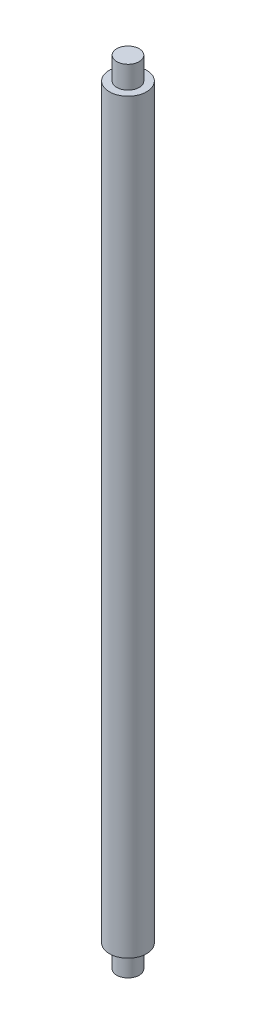
ISO-10303-21;
HEADER;
FILE_DESCRIPTION(('STEP AP214'),'2;1');
FILE_NAME('part.step','',(''),(''),'','','');
FILE_SCHEMA(('AUTOMOTIVE_DESIGN { 1 0 10303 214 1 1 1 1 }'));
ENDSEC;
DATA;
#1=APPLICATION_CONTEXT('core data for automotive mechanical design processes');
#2=APPLICATION_PROTOCOL_DEFINITION('international standard','automotive_design',2000,#1);
#3=PRODUCT_CONTEXT('',#1,'mechanical');
#4=PRODUCT('Part','Part','',(#3));
#5=PRODUCT_RELATED_PRODUCT_CATEGORY('part','',(#4));
#6=PRODUCT_DEFINITION_FORMATION('','',#4);
#7=PRODUCT_DEFINITION_CONTEXT('part definition',#1,'design');
#8=PRODUCT_DEFINITION('design','',#6,#7);
#9=PRODUCT_DEFINITION_SHAPE('','',#8);
#10=(LENGTH_UNIT() NAMED_UNIT(*) SI_UNIT(.MILLI.,.METRE.));
#11=(NAMED_UNIT(*) PLANE_ANGLE_UNIT() SI_UNIT($,.RADIAN.));
#12=(NAMED_UNIT(*) SI_UNIT($,.STERADIAN.) SOLID_ANGLE_UNIT());
#13=UNCERTAINTY_MEASURE_WITH_UNIT(LENGTH_MEASURE(1.E-05),#10,'distance_accuracy_value','');
#14=(GEOMETRIC_REPRESENTATION_CONTEXT(3) GLOBAL_UNCERTAINTY_ASSIGNED_CONTEXT((#13)) GLOBAL_UNIT_ASSIGNED_CONTEXT((#10,
#11,#12)) REPRESENTATION_CONTEXT('',''));
#15=CARTESIAN_POINT('',(0.,0.,0.));
#16=DIRECTION('',(0.,0.,1.));
#17=DIRECTION('',(1.,0.,0.));
#18=AXIS2_PLACEMENT_3D('',#15,#16,#17);
#19=CARTESIAN_POINT('',(0.,-50.,0.));
#20=DIRECTION('',(0.,1.,0.));
#21=DIRECTION('',(0.,0.,1.));
#22=AXIS2_PLACEMENT_3D('',#19,#20,#21);
#23=CYLINDRICAL_SURFACE('',#22,2.5);
#24=CARTESIAN_POINT('',(0.,-50.,0.));
#25=DIRECTION('',(0.,1.,0.));
#26=DIRECTION('',(0.,0.,1.));
#27=AXIS2_PLACEMENT_3D('',#24,#25,#26);
#28=CIRCLE('',#27,2.5);
#29=CARTESIAN_POINT('',(0.,-50.,2.5));
#30=VERTEX_POINT('',#29);
#31=EDGE_CURVE('E50',#30,#30,#28,.T.);
#32=ORIENTED_EDGE('',*,*,#31,.T.);
#33=EDGE_LOOP('',(#32));
#34=FACE_BOUND('',#33,.T.);
#35=CARTESIAN_POINT('',(0.,50.,0.));
#36=DIRECTION('',(0.,1.,0.));
#37=DIRECTION('',(0.,0.,1.));
#38=AXIS2_PLACEMENT_3D('',#35,#36,#37);
#39=CIRCLE('',#38,2.5);
#40=CARTESIAN_POINT('',(0.,50.,2.5));
#41=VERTEX_POINT('',#40);
#42=EDGE_CURVE('E41',#41,#41,#39,.T.);
#43=ORIENTED_EDGE('',*,*,#42,.F.);
#44=EDGE_LOOP('',(#43));
#45=FACE_BOUND('',#44,.T.);
#46=ADVANCED_FACE('F38',(#34,#45),#23,.T.);
#47=CARTESIAN_POINT('',(0.,-50.,0.));
#48=DIRECTION('',(0.,1.,0.));
#49=DIRECTION('',(0.,0.,1.));
#50=AXIS2_PLACEMENT_3D('',#47,#48,#49);
#51=PLANE('',#50);
#52=CARTESIAN_POINT('',(0.,-50.,0.));
#53=DIRECTION('',(0.,-1.,0.));
#54=DIRECTION('',(0.,0.,-1.));
#55=AXIS2_PLACEMENT_3D('',#52,#53,#54);
#56=CIRCLE('',#55,1.5);
#57=CARTESIAN_POINT('',(0.,-50.,-1.5));
#58=VERTEX_POINT('',#57);
#59=EDGE_CURVE('E10',#58,#58,#56,.T.);
#60=ORIENTED_EDGE('',*,*,#59,.F.);
#61=EDGE_LOOP('',(#60));
#62=FACE_BOUND('',#61,.T.);
#63=ORIENTED_EDGE('',*,*,#31,.F.);
#64=EDGE_LOOP('',(#63));
#65=FACE_BOUND('',#64,.T.);
#66=ADVANCED_FACE('F66',(#62,#65),#51,.F.);
#67=CARTESIAN_POINT('',(0.,50.,0.));
#68=DIRECTION('',(0.,1.,0.));
#69=DIRECTION('',(0.,0.,1.));
#70=AXIS2_PLACEMENT_3D('',#67,#68,#69);
#71=PLANE('',#70);
#72=CARTESIAN_POINT('',(0.,50.,0.));
#73=DIRECTION('',(0.,1.,0.));
#74=DIRECTION('',(0.,0.,1.));
#75=AXIS2_PLACEMENT_3D('',#72,#73,#74);
#76=CIRCLE('',#75,1.5);
#77=CARTESIAN_POINT('',(0.,50.,1.5));
#78=VERTEX_POINT('',#77);
#79=EDGE_CURVE('E45',#78,#78,#76,.T.);
#80=ORIENTED_EDGE('',*,*,#79,.F.);
#81=EDGE_LOOP('',(#80));
#82=FACE_BOUND('',#81,.T.);
#83=ORIENTED_EDGE('',*,*,#42,.T.);
#84=EDGE_LOOP('',(#83));
#85=FACE_BOUND('',#84,.T.);
#86=ADVANCED_FACE('F63',(#82,#85),#71,.T.);
#87=CARTESIAN_POINT('',(0.,53.,0.));
#88=DIRECTION('',(0.,-1.,0.));
#89=DIRECTION('',(0.,0.,-1.));
#90=AXIS2_PLACEMENT_3D('',#87,#88,#89);
#91=CYLINDRICAL_SURFACE('',#90,1.5);
#92=CARTESIAN_POINT('',(0.,53.,0.));
#93=DIRECTION('',(0.,1.,0.));
#94=DIRECTION('',(0.,0.,1.));
#95=AXIS2_PLACEMENT_3D('',#92,#93,#94);
#96=CIRCLE('',#95,1.5);
#97=CARTESIAN_POINT('',(0.,53.,1.5));
#98=VERTEX_POINT('',#97);
#99=EDGE_CURVE('E55',#98,#98,#96,.T.);
#100=ORIENTED_EDGE('',*,*,#99,.F.);
#101=EDGE_LOOP('',(#100));
#102=FACE_BOUND('',#101,.T.);
#103=ORIENTED_EDGE('',*,*,#79,.T.);
#104=EDGE_LOOP('',(#103));
#105=FACE_BOUND('',#104,.T.);
#106=ADVANCED_FACE('F75',(#102,#105),#91,.T.);
#107=CARTESIAN_POINT('',(0.,53.,0.));
#108=DIRECTION('',(0.,1.,0.));
#109=DIRECTION('',(0.,0.,1.));
#110=AXIS2_PLACEMENT_3D('',#107,#108,#109);
#111=PLANE('',#110);
#112=ORIENTED_EDGE('',*,*,#99,.T.);
#113=EDGE_LOOP('',(#112));
#114=FACE_BOUND('',#113,.T.);
#115=ADVANCED_FACE('F81',(#114),#111,.T.);
#116=CARTESIAN_POINT('',(0.,-53.,0.));
#117=DIRECTION('',(0.,1.,0.));
#118=DIRECTION('',(0.,0.,1.));
#119=AXIS2_PLACEMENT_3D('',#116,#117,#118);
#120=CYLINDRICAL_SURFACE('',#119,1.5);
#121=CARTESIAN_POINT('',(0.,-53.,0.));
#122=DIRECTION('',(0.,-1.,0.));
#123=DIRECTION('',(0.,0.,-1.));
#124=AXIS2_PLACEMENT_3D('',#121,#122,#123);
#125=CIRCLE('',#124,1.5);
#126=CARTESIAN_POINT('',(0.,-53.,-1.5));
#127=VERTEX_POINT('',#126);
#128=EDGE_CURVE('E54',#127,#127,#125,.T.);
#129=ORIENTED_EDGE('',*,*,#128,.F.);
#130=EDGE_LOOP('',(#129));
#131=FACE_BOUND('',#130,.T.);
#132=ORIENTED_EDGE('',*,*,#59,.T.);
#133=EDGE_LOOP('',(#132));
#134=FACE_BOUND('',#133,.T.);
#135=ADVANCED_FACE('F85',(#131,#134),#120,.T.);
#136=CARTESIAN_POINT('',(0.,-53.,0.));
#137=DIRECTION('',(0.,-1.,0.));
#138=DIRECTION('',(0.,0.,-1.));
#139=AXIS2_PLACEMENT_3D('',#136,#137,#138);
#140=PLANE('',#139);
#141=ORIENTED_EDGE('',*,*,#128,.T.);
#142=EDGE_LOOP('',(#141));
#143=FACE_BOUND('',#142,.T.);
#144=ADVANCED_FACE('F89',(#143),#140,.T.);
#145=CLOSED_SHELL('',(#46,#66,#86,#106,#115,#135,#144));
#146=MANIFOLD_SOLID_BREP('B2',#145);
#147=ADVANCED_BREP_SHAPE_REPRESENTATION('',(#18,#146),#14);
#148=SHAPE_DEFINITION_REPRESENTATION(#9,#147);
ENDSEC;
END-ISO-10303-21;
